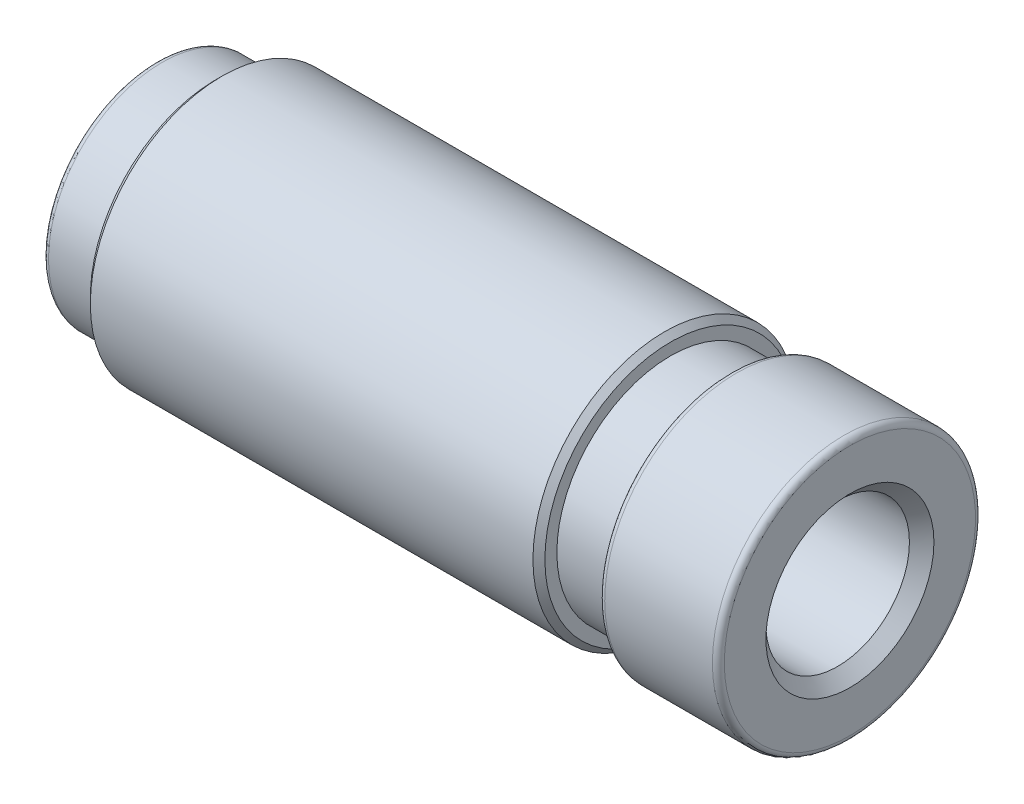
ISO-10303-21;
HEADER;
FILE_DESCRIPTION(('STEP AP214'),'2;1');
FILE_NAME('part.step','',(''),(''),'','','');
FILE_SCHEMA(('AUTOMOTIVE_DESIGN { 1 0 10303 214 1 1 1 1 }'));
ENDSEC;
DATA;
#1=APPLICATION_CONTEXT('core data for automotive mechanical design processes');
#2=APPLICATION_PROTOCOL_DEFINITION('international standard','automotive_design',2000,#1);
#3=PRODUCT_CONTEXT('',#1,'mechanical');
#4=PRODUCT('Part','Part','',(#3));
#5=PRODUCT_RELATED_PRODUCT_CATEGORY('part','',(#4));
#6=PRODUCT_DEFINITION_FORMATION('','',#4);
#7=PRODUCT_DEFINITION_CONTEXT('part definition',#1,'design');
#8=PRODUCT_DEFINITION('design','',#6,#7);
#9=PRODUCT_DEFINITION_SHAPE('','',#8);
#10=(LENGTH_UNIT() NAMED_UNIT(*) SI_UNIT(.MILLI.,.METRE.));
#11=(NAMED_UNIT(*) PLANE_ANGLE_UNIT() SI_UNIT($,.RADIAN.));
#12=(NAMED_UNIT(*) SI_UNIT($,.STERADIAN.) SOLID_ANGLE_UNIT());
#13=UNCERTAINTY_MEASURE_WITH_UNIT(LENGTH_MEASURE(1.E-05),#10,'distance_accuracy_value','');
#14=(GEOMETRIC_REPRESENTATION_CONTEXT(3) GLOBAL_UNCERTAINTY_ASSIGNED_CONTEXT((#13)) GLOBAL_UNIT_ASSIGNED_CONTEXT((#10,
#11,#12)) REPRESENTATION_CONTEXT('',''));
#15=CARTESIAN_POINT('',(0.,0.,0.));
#16=DIRECTION('',(0.,0.,1.));
#17=DIRECTION('',(1.,0.,0.));
#18=AXIS2_PLACEMENT_3D('',#15,#16,#17);
#19=CARTESIAN_POINT('',(0.,9.49999999999999,0.));
#20=DIRECTION('',(1.,0.,0.));
#21=DIRECTION('',(0.,0.,-1.));
#22=AXIS2_PLACEMENT_3D('',#19,#20,#21);
#23=PLANE('',#22);
#24=CARTESIAN_POINT('',(0.,0.,0.));
#25=DIRECTION('',(1.,0.,0.));
#26=DIRECTION('',(0.,0.,-1.));
#27=AXIS2_PLACEMENT_3D('',#24,#25,#26);
#28=CIRCLE('',#27,8.);
#29=CARTESIAN_POINT('',(0.,0.,-8.));
#30=VERTEX_POINT('',#29);
#31=EDGE_CURVE('E58',#30,#30,#28,.T.);
#32=ORIENTED_EDGE('',*,*,#31,.T.);
#33=EDGE_LOOP('',(#32));
#34=FACE_BOUND('',#33,.T.);
#35=CARTESIAN_POINT('',(0.,0.,0.));
#36=DIRECTION('',(1.,0.,0.));
#37=DIRECTION('',(0.,0.,-1.));
#38=AXIS2_PLACEMENT_3D('',#35,#36,#37);
#39=CIRCLE('',#38,8.99999999999999);
#40=CARTESIAN_POINT('',(0.,0.,-8.99999999999999));
#41=VERTEX_POINT('',#40);
#42=EDGE_CURVE('E67',#41,#41,#39,.F.);
#43=ORIENTED_EDGE('',*,*,#42,.T.);
#44=EDGE_LOOP('',(#43));
#45=FACE_BOUND('',#44,.T.);
#46=ADVANCED_FACE('F38',(#34,#45),#23,.F.);
#47=CARTESIAN_POINT('',(58.,0.,0.));
#48=DIRECTION('',(-1.,0.,0.));
#49=DIRECTION('',(0.,0.,1.));
#50=AXIS2_PLACEMENT_3D('',#47,#48,#49);
#51=PLANE('',#50);
#52=CARTESIAN_POINT('',(58.,0.,0.));
#53=DIRECTION('',(-1.,0.,0.));
#54=DIRECTION('',(0.,0.,1.));
#55=AXIS2_PLACEMENT_3D('',#52,#53,#54);
#56=CIRCLE('',#55,10.5);
#57=CARTESIAN_POINT('',(58.,0.,10.5));
#58=VERTEX_POINT('',#57);
#59=EDGE_CURVE('E73',#58,#58,#56,.F.);
#60=ORIENTED_EDGE('',*,*,#59,.T.);
#61=EDGE_LOOP('',(#60));
#62=FACE_BOUND('',#61,.T.);
#63=CARTESIAN_POINT('',(58.,0.,0.));
#64=DIRECTION('',(1.,0.,0.));
#65=DIRECTION('',(0.,0.,-1.));
#66=AXIS2_PLACEMENT_3D('',#63,#64,#65);
#67=CIRCLE('',#66,7.025);
#68=CARTESIAN_POINT('',(58.,0.,-7.025));
#69=VERTEX_POINT('',#68);
#70=EDGE_CURVE('E100',#69,#69,#67,.T.);
#71=ORIENTED_EDGE('',*,*,#70,.F.);
#72=EDGE_LOOP('',(#71));
#73=FACE_BOUND('',#72,.T.);
#74=ADVANCED_FACE('F106',(#62,#73),#51,.F.);
#75=CARTESIAN_POINT('',(0.,0.,0.));
#76=DIRECTION('',(-1.,0.,0.));
#77=DIRECTION('',(0.,0.,1.));
#78=AXIS2_PLACEMENT_3D('',#75,#76,#77);
#79=CYLINDRICAL_SURFACE('',#78,11.);
#80=CARTESIAN_POINT('',(57.5,0.,0.));
#81=DIRECTION('',(-1.,0.,0.));
#82=DIRECTION('',(0.,0.,1.));
#83=AXIS2_PLACEMENT_3D('',#80,#81,#82);
#84=CIRCLE('',#83,11.);
#85=CARTESIAN_POINT('',(57.5,0.,11.));
#86=VERTEX_POINT('',#85);
#87=EDGE_CURVE('E76',#86,#86,#84,.T.);
#88=ORIENTED_EDGE('',*,*,#87,.T.);
#89=EDGE_LOOP('',(#88));
#90=FACE_BOUND('',#89,.T.);
#91=CARTESIAN_POINT('',(48.5,0.,0.));
#92=DIRECTION('',(1.,0.,0.));
#93=DIRECTION('',(0.,0.,-1.));
#94=AXIS2_PLACEMENT_3D('',#91,#92,#93);
#95=CIRCLE('',#94,11.);
#96=CARTESIAN_POINT('',(48.5,0.,-11.));
#97=VERTEX_POINT('',#96);
#98=EDGE_CURVE('E79',#97,#97,#95,.T.);
#99=ORIENTED_EDGE('',*,*,#98,.T.);
#100=EDGE_LOOP('',(#99));
#101=FACE_BOUND('',#100,.T.);
#102=ADVANCED_FACE('F108',(#90,#101),#79,.T.);
#103=CARTESIAN_POINT('',(48.,11.,0.));
#104=DIRECTION('',(1.,0.,0.));
#105=DIRECTION('',(0.,0.,-1.));
#106=AXIS2_PLACEMENT_3D('',#103,#104,#105);
#107=PLANE('',#106);
#108=CARTESIAN_POINT('',(48.,0.,0.));
#109=DIRECTION('',(1.,0.,0.));
#110=DIRECTION('',(0.,0.,-1.));
#111=AXIS2_PLACEMENT_3D('',#108,#109,#110);
#112=CIRCLE('',#111,10.5);
#113=CARTESIAN_POINT('',(48.,0.,-10.5));
#114=VERTEX_POINT('',#113);
#115=EDGE_CURVE('E70',#114,#114,#112,.F.);
#116=ORIENTED_EDGE('',*,*,#115,.T.);
#117=EDGE_LOOP('',(#116));
#118=FACE_BOUND('',#117,.T.);
#119=CARTESIAN_POINT('',(48.,0.,0.));
#120=DIRECTION('',(-1.,0.,0.));
#121=DIRECTION('',(0.,0.,1.));
#122=AXIS2_PLACEMENT_3D('',#119,#120,#121);
#123=CIRCLE('',#122,9.5);
#124=CARTESIAN_POINT('',(48.,0.,9.5));
#125=VERTEX_POINT('',#124);
#126=EDGE_CURVE('E82',#125,#125,#123,.T.);
#127=ORIENTED_EDGE('',*,*,#126,.F.);
#128=EDGE_LOOP('',(#127));
#129=FACE_BOUND('',#128,.T.);
#130=ADVANCED_FACE('F115',(#118,#129),#107,.F.);
#131=CARTESIAN_POINT('',(0.,0.,0.));
#132=DIRECTION('',(-1.,0.,0.));
#133=DIRECTION('',(0.,0.,1.));
#134=AXIS2_PLACEMENT_3D('',#131,#132,#133);
#135=CYLINDRICAL_SURFACE('',#134,9.5);
#136=CARTESIAN_POINT('',(43.,0.,0.));
#137=DIRECTION('',(-1.,0.,0.));
#138=DIRECTION('',(0.,0.,1.));
#139=AXIS2_PLACEMENT_3D('',#136,#137,#138);
#140=CIRCLE('',#139,9.5);
#141=CARTESIAN_POINT('',(43.,0.,9.5));
#142=VERTEX_POINT('',#141);
#143=EDGE_CURVE('E90',#142,#142,#140,.T.);
#144=ORIENTED_EDGE('',*,*,#143,.F.);
#145=EDGE_LOOP('',(#144));
#146=FACE_BOUND('',#145,.T.);
#147=ORIENTED_EDGE('',*,*,#126,.T.);
#148=EDGE_LOOP('',(#147));
#149=FACE_BOUND('',#148,.T.);
#150=ADVANCED_FACE('F161',(#146,#149),#135,.T.);
#151=CARTESIAN_POINT('',(43.,11.,0.));
#152=DIRECTION('',(-1.,0.,0.));
#153=DIRECTION('',(0.,0.,1.));
#154=AXIS2_PLACEMENT_3D('',#151,#152,#153);
#155=PLANE('',#154);
#156=CARTESIAN_POINT('',(43.,0.,0.));
#157=DIRECTION('',(-1.,0.,0.));
#158=DIRECTION('',(0.,0.,1.));
#159=AXIS2_PLACEMENT_3D('',#156,#157,#158);
#160=CIRCLE('',#159,10.5);
#161=CARTESIAN_POINT('',(43.,0.,10.5));
#162=VERTEX_POINT('',#161);
#163=EDGE_CURVE('E45',#162,#162,#160,.F.);
#164=ORIENTED_EDGE('',*,*,#163,.T.);
#165=EDGE_LOOP('',(#164));
#166=FACE_BOUND('',#165,.T.);
#167=ORIENTED_EDGE('',*,*,#143,.T.);
#168=EDGE_LOOP('',(#167));
#169=FACE_BOUND('',#168,.T.);
#170=ADVANCED_FACE('F151',(#166,#169),#155,.F.);
#171=CARTESIAN_POINT('',(0.,0.,0.));
#172=DIRECTION('',(-1.,0.,0.));
#173=DIRECTION('',(0.,0.,1.));
#174=AXIS2_PLACEMENT_3D('',#171,#172,#173);
#175=CYLINDRICAL_SURFACE('',#174,11.);
#176=CARTESIAN_POINT('',(42.5,0.,0.));
#177=DIRECTION('',(-1.,0.,0.));
#178=DIRECTION('',(0.,0.,1.));
#179=AXIS2_PLACEMENT_3D('',#176,#177,#178);
#180=CIRCLE('',#179,11.);
#181=CARTESIAN_POINT('',(42.5,0.,11.));
#182=VERTEX_POINT('',#181);
#183=EDGE_CURVE('E49',#182,#182,#180,.T.);
#184=ORIENTED_EDGE('',*,*,#183,.T.);
#185=EDGE_LOOP('',(#184));
#186=FACE_BOUND('',#185,.T.);
#187=CARTESIAN_POINT('',(5.49999999999999,0.,0.));
#188=DIRECTION('',(1.,0.,0.));
#189=DIRECTION('',(0.,0.,-1.));
#190=AXIS2_PLACEMENT_3D('',#187,#188,#189);
#191=CIRCLE('',#190,11.);
#192=CARTESIAN_POINT('',(5.49999999999999,0.,-11.));
#193=VERTEX_POINT('',#192);
#194=EDGE_CURVE('E53',#193,#193,#191,.T.);
#195=ORIENTED_EDGE('',*,*,#194,.T.);
#196=EDGE_LOOP('',(#195));
#197=FACE_BOUND('',#196,.T.);
#198=ADVANCED_FACE('F147',(#186,#197),#175,.T.);
#199=CARTESIAN_POINT('',(5.,11.,0.));
#200=DIRECTION('',(1.,0.,0.));
#201=DIRECTION('',(0.,0.,-1.));
#202=AXIS2_PLACEMENT_3D('',#199,#200,#201);
#203=PLANE('',#202);
#204=CARTESIAN_POINT('',(5.,0.,0.));
#205=DIRECTION('',(1.,0.,0.));
#206=DIRECTION('',(0.,0.,-1.));
#207=AXIS2_PLACEMENT_3D('',#204,#205,#206);
#208=CIRCLE('',#207,10.5);
#209=CARTESIAN_POINT('',(5.,0.,-10.5));
#210=VERTEX_POINT('',#209);
#211=EDGE_CURVE('E10',#210,#210,#208,.F.);
#212=ORIENTED_EDGE('',*,*,#211,.T.);
#213=EDGE_LOOP('',(#212));
#214=FACE_BOUND('',#213,.T.);
#215=CARTESIAN_POINT('',(5.,0.,0.));
#216=DIRECTION('',(-1.,0.,0.));
#217=DIRECTION('',(0.,0.,1.));
#218=AXIS2_PLACEMENT_3D('',#215,#216,#217);
#219=CIRCLE('',#218,9.49999999999999);
#220=CARTESIAN_POINT('',(5.,0.,9.49999999999999));
#221=VERTEX_POINT('',#220);
#222=EDGE_CURVE('E93',#221,#221,#219,.T.);
#223=ORIENTED_EDGE('',*,*,#222,.F.);
#224=EDGE_LOOP('',(#223));
#225=FACE_BOUND('',#224,.T.);
#226=ADVANCED_FACE('F150',(#214,#225),#203,.F.);
#227=CARTESIAN_POINT('',(0.,0.,0.));
#228=DIRECTION('',(-1.,0.,0.));
#229=DIRECTION('',(0.,0.,1.));
#230=AXIS2_PLACEMENT_3D('',#227,#228,#229);
#231=CYLINDRICAL_SURFACE('',#230,9.49999999999999);
#232=CARTESIAN_POINT('',(0.5,0.,0.));
#233=DIRECTION('',(1.,0.,0.));
#234=DIRECTION('',(0.,0.,-1.));
#235=AXIS2_PLACEMENT_3D('',#232,#233,#234);
#236=CIRCLE('',#235,9.49999999999999);
#237=CARTESIAN_POINT('',(0.5,0.,-9.49999999999999));
#238=VERTEX_POINT('',#237);
#239=EDGE_CURVE('E64',#238,#238,#236,.T.);
#240=ORIENTED_EDGE('',*,*,#239,.T.);
#241=EDGE_LOOP('',(#240));
#242=FACE_BOUND('',#241,.T.);
#243=ORIENTED_EDGE('',*,*,#222,.T.);
#244=EDGE_LOOP('',(#243));
#245=FACE_BOUND('',#244,.T.);
#246=ADVANCED_FACE('F159',(#242,#245),#231,.T.);
#247=CARTESIAN_POINT('',(25.,0.,0.));
#248=DIRECTION('',(-1.,0.,0.));
#249=DIRECTION('',(0.,0.,1.));
#250=AXIS2_PLACEMENT_3D('',#247,#248,#249);
#251=CYLINDRICAL_SURFACE('',#250,7.);
#252=CARTESIAN_POINT('',(1.,0.,0.));
#253=DIRECTION('',(1.,0.,0.));
#254=DIRECTION('',(0.,0.,-1.));
#255=AXIS2_PLACEMENT_3D('',#252,#253,#254);
#256=CIRCLE('',#255,7.);
#257=CARTESIAN_POINT('',(1.,0.,-7.));
#258=VERTEX_POINT('',#257);
#259=EDGE_CURVE('E61',#258,#258,#256,.F.);
#260=ORIENTED_EDGE('',*,*,#259,.T.);
#261=EDGE_LOOP('',(#260));
#262=FACE_BOUND('',#261,.T.);
#263=CARTESIAN_POINT('',(25.,0.,0.));
#264=DIRECTION('',(-1.,0.,0.));
#265=DIRECTION('',(0.,0.,1.));
#266=AXIS2_PLACEMENT_3D('',#263,#264,#265);
#267=CIRCLE('',#266,7.);
#268=CARTESIAN_POINT('',(25.,0.,7.));
#269=VERTEX_POINT('',#268);
#270=EDGE_CURVE('E86',#269,#269,#267,.T.);
#271=ORIENTED_EDGE('',*,*,#270,.F.);
#272=EDGE_LOOP('',(#271));
#273=FACE_BOUND('',#272,.T.);
#274=ADVANCED_FACE('F206',(#262,#273),#251,.F.);
#275=CARTESIAN_POINT('',(25.,0.,0.));
#276=DIRECTION('',(-1.,0.,0.));
#277=DIRECTION('',(0.,0.,1.));
#278=AXIS2_PLACEMENT_3D('',#275,#276,#277);
#279=PLANE('',#278);
#280=CARTESIAN_POINT('',(25.,0.,0.));
#281=DIRECTION('',(-1.,0.,0.));
#282=DIRECTION('',(0.,0.,1.));
#283=AXIS2_PLACEMENT_3D('',#280,#281,#282);
#284=CIRCLE('',#283,5.99999999999999);
#285=CARTESIAN_POINT('',(25.,0.,5.99999999999999));
#286=VERTEX_POINT('',#285);
#287=EDGE_CURVE('E83',#286,#286,#284,.T.);
#288=ORIENTED_EDGE('',*,*,#287,.F.);
#289=EDGE_LOOP('',(#288));
#290=FACE_BOUND('',#289,.T.);
#291=ORIENTED_EDGE('',*,*,#270,.T.);
#292=EDGE_LOOP('',(#291));
#293=FACE_BOUND('',#292,.T.);
#294=ADVANCED_FACE('F215',(#290,#293),#279,.T.);
#295=CARTESIAN_POINT('',(58.,0.,0.));
#296=DIRECTION('',(1.,0.,0.));
#297=DIRECTION('',(0.,0.,-1.));
#298=AXIS2_PLACEMENT_3D('',#295,#296,#297);
#299=CYLINDRICAL_SURFACE('',#298,5.99999999999999);
#300=ORIENTED_EDGE('',*,*,#287,.T.);
#301=EDGE_LOOP('',(#300));
#302=FACE_BOUND('',#301,.T.);
#303=CARTESIAN_POINT('',(56.975,0.,0.));
#304=DIRECTION('',(1.,0.,0.));
#305=DIRECTION('',(0.,0.,-1.));
#306=AXIS2_PLACEMENT_3D('',#303,#304,#305);
#307=CIRCLE('',#306,6.);
#308=CARTESIAN_POINT('',(56.975,0.,-6.));
#309=VERTEX_POINT('',#308);
#310=EDGE_CURVE('E87',#309,#309,#307,.T.);
#311=ORIENTED_EDGE('',*,*,#310,.T.);
#312=EDGE_LOOP('',(#311));
#313=FACE_BOUND('',#312,.T.);
#314=ADVANCED_FACE('F225',(#302,#313),#299,.F.);
#315=CARTESIAN_POINT('',(58.,0.,0.));
#316=DIRECTION('',(1.,0.,0.));
#317=DIRECTION('',(0.,0.,-1.));
#318=AXIS2_PLACEMENT_3D('',#315,#316,#317);
#319=CONICAL_SURFACE('',#318,7.025,0.785398163397448);
#320=ORIENTED_EDGE('',*,*,#310,.F.);
#321=EDGE_LOOP('',(#320));
#322=FACE_BOUND('',#321,.T.);
#323=ORIENTED_EDGE('',*,*,#70,.T.);
#324=EDGE_LOOP('',(#323));
#325=FACE_BOUND('',#324,.T.);
#326=ADVANCED_FACE('F104',(#322,#325),#319,.F.);
#327=CARTESIAN_POINT('',(57.5,0.,0.));
#328=DIRECTION('',(-1.,0.,0.));
#329=DIRECTION('',(0.,0.,1.));
#330=AXIS2_PLACEMENT_3D('',#327,#328,#329);
#331=TOROIDAL_SURFACE('',#330,10.5,0.5);
#332=ORIENTED_EDGE('',*,*,#59,.F.);
#333=EDGE_LOOP('',(#332));
#334=FACE_BOUND('',#333,.T.);
#335=ORIENTED_EDGE('',*,*,#87,.F.);
#336=EDGE_LOOP('',(#335));
#337=FACE_BOUND('',#336,.T.);
#338=ADVANCED_FACE('F122',(#334,#337),#331,.T.);
#339=CARTESIAN_POINT('',(48.5,0.,0.));
#340=DIRECTION('',(1.,0.,0.));
#341=DIRECTION('',(0.,0.,-1.));
#342=AXIS2_PLACEMENT_3D('',#339,#340,#341);
#343=TOROIDAL_SURFACE('',#342,10.5,0.5);
#344=ORIENTED_EDGE('',*,*,#98,.F.);
#345=EDGE_LOOP('',(#344));
#346=FACE_BOUND('',#345,.T.);
#347=ORIENTED_EDGE('',*,*,#115,.F.);
#348=EDGE_LOOP('',(#347));
#349=FACE_BOUND('',#348,.T.);
#350=ADVANCED_FACE('F125',(#346,#349),#343,.T.);
#351=CARTESIAN_POINT('',(0.5,0.,0.));
#352=DIRECTION('',(1.,0.,0.));
#353=DIRECTION('',(0.,0.,-1.));
#354=AXIS2_PLACEMENT_3D('',#351,#352,#353);
#355=TOROIDAL_SURFACE('',#354,8.99999999999999,0.5);
#356=ORIENTED_EDGE('',*,*,#239,.F.);
#357=EDGE_LOOP('',(#356));
#358=FACE_BOUND('',#357,.T.);
#359=ORIENTED_EDGE('',*,*,#42,.F.);
#360=EDGE_LOOP('',(#359));
#361=FACE_BOUND('',#360,.T.);
#362=ADVANCED_FACE('F129',(#358,#361),#355,.T.);
#363=CARTESIAN_POINT('',(1.,0.,0.));
#364=DIRECTION('',(1.,0.,0.));
#365=DIRECTION('',(0.,0.,-1.));
#366=AXIS2_PLACEMENT_3D('',#363,#364,#365);
#367=TOROIDAL_SURFACE('',#366,8.,1.);
#368=ORIENTED_EDGE('',*,*,#31,.F.);
#369=EDGE_LOOP('',(#368));
#370=FACE_BOUND('',#369,.T.);
#371=ORIENTED_EDGE('',*,*,#259,.F.);
#372=EDGE_LOOP('',(#371));
#373=FACE_BOUND('',#372,.T.);
#374=ADVANCED_FACE('F133',(#370,#373),#367,.T.);
#375=CARTESIAN_POINT('',(42.5,0.,0.));
#376=DIRECTION('',(-1.,0.,0.));
#377=DIRECTION('',(0.,0.,1.));
#378=AXIS2_PLACEMENT_3D('',#375,#376,#377);
#379=CONICAL_SURFACE('',#378,11.,0.785398163397441);
#380=ORIENTED_EDGE('',*,*,#163,.F.);
#381=EDGE_LOOP('',(#380));
#382=FACE_BOUND('',#381,.T.);
#383=ORIENTED_EDGE('',*,*,#183,.F.);
#384=EDGE_LOOP('',(#383));
#385=FACE_BOUND('',#384,.T.);
#386=ADVANCED_FACE('F136',(#382,#385),#379,.T.);
#387=CARTESIAN_POINT('',(5.,0.,0.));
#388=DIRECTION('',(1.,0.,0.));
#389=DIRECTION('',(0.,0.,-1.));
#390=AXIS2_PLACEMENT_3D('',#387,#388,#389);
#391=CONICAL_SURFACE('',#390,10.5,0.785398163397438);
#392=ORIENTED_EDGE('',*,*,#194,.F.);
#393=EDGE_LOOP('',(#392));
#394=FACE_BOUND('',#393,.T.);
#395=ORIENTED_EDGE('',*,*,#211,.F.);
#396=EDGE_LOOP('',(#395));
#397=FACE_BOUND('',#396,.T.);
#398=ADVANCED_FACE('F40',(#394,#397),#391,.T.);
#399=CLOSED_SHELL('',(#46,#74,#102,#130,#150,#170,#198,#226,#246,#274,#294,#314,#326,#338,#350,
#362,#374,#386,#398));
#400=MANIFOLD_SOLID_BREP('B2',#399);
#401=ADVANCED_BREP_SHAPE_REPRESENTATION('',(#18,#400),#14);
#402=SHAPE_DEFINITION_REPRESENTATION(#9,#401);
ENDSEC;
END-ISO-10303-21;
